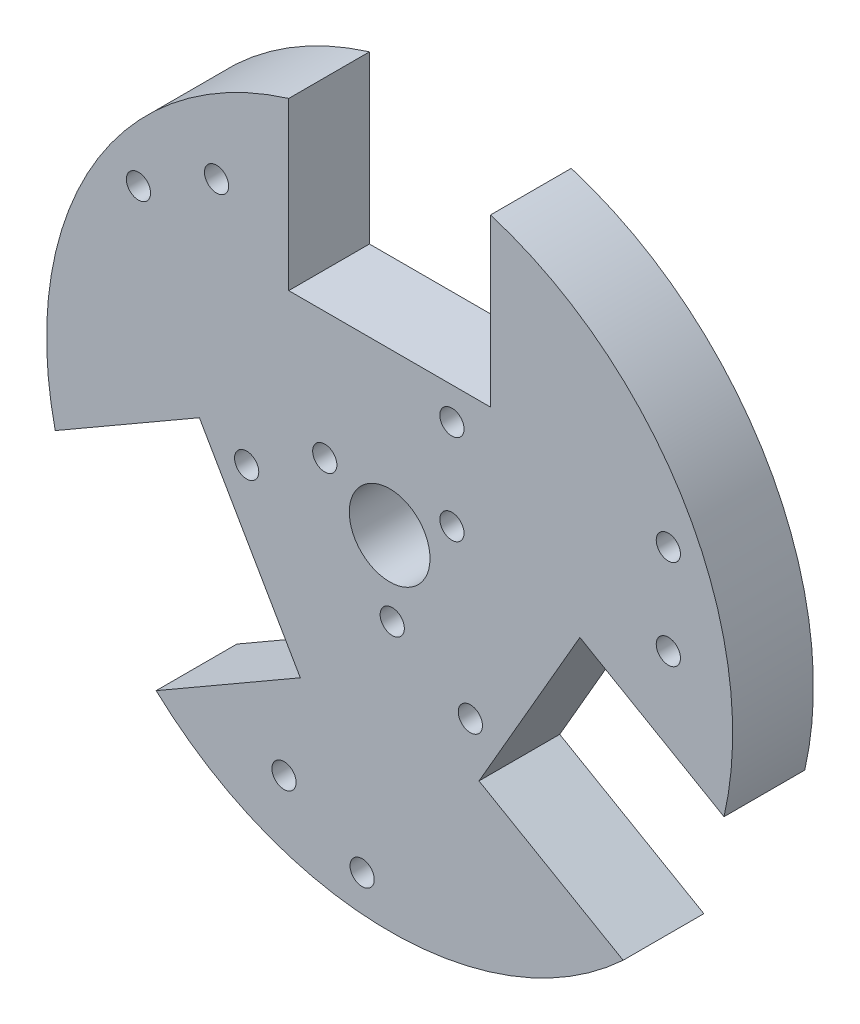
ISO-10303-21;
HEADER;
FILE_DESCRIPTION(('STEP AP214'),'2;1');
FILE_NAME('part.step','',(''),(''),'','','');
FILE_SCHEMA(('AUTOMOTIVE_DESIGN { 1 0 10303 214 1 1 1 1 }'));
ENDSEC;
DATA;
#1=APPLICATION_CONTEXT('core data for automotive mechanical design processes');
#2=APPLICATION_PROTOCOL_DEFINITION('international standard','automotive_design',2000,#1);
#3=PRODUCT_CONTEXT('',#1,'mechanical');
#4=PRODUCT('Part','Part','',(#3));
#5=PRODUCT_RELATED_PRODUCT_CATEGORY('part','',(#4));
#6=PRODUCT_DEFINITION_FORMATION('','',#4);
#7=PRODUCT_DEFINITION_CONTEXT('part definition',#1,'design');
#8=PRODUCT_DEFINITION('design','',#6,#7);
#9=PRODUCT_DEFINITION_SHAPE('','',#8);
#10=(LENGTH_UNIT() NAMED_UNIT(*) SI_UNIT(.MILLI.,.METRE.));
#11=(NAMED_UNIT(*) PLANE_ANGLE_UNIT() SI_UNIT($,.RADIAN.));
#12=(NAMED_UNIT(*) SI_UNIT($,.STERADIAN.) SOLID_ANGLE_UNIT());
#13=UNCERTAINTY_MEASURE_WITH_UNIT(LENGTH_MEASURE(1.E-05),#10,'distance_accuracy_value','');
#14=(GEOMETRIC_REPRESENTATION_CONTEXT(3) GLOBAL_UNCERTAINTY_ASSIGNED_CONTEXT((#13)) GLOBAL_UNIT_ASSIGNED_CONTEXT((#10,
#11,#12)) REPRESENTATION_CONTEXT('',''));
#15=CARTESIAN_POINT('',(0.,0.,0.));
#16=DIRECTION('',(0.,0.,1.));
#17=DIRECTION('',(1.,0.,0.));
#18=AXIS2_PLACEMENT_3D('',#15,#16,#17);
#19=CARTESIAN_POINT('',(0.,0.,10.));
#20=DIRECTION('',(0.,0.,-1.));
#21=DIRECTION('',(-1.,0.,0.));
#22=AXIS2_PLACEMENT_3D('',#19,#20,#21);
#23=CYLINDRICAL_SURFACE('',#22,42.5);
#24=DIRECTION('',(0.,0.,-1.));
#25=VECTOR('',#24,1.);
#26=CARTESIAN_POINT('',(-41.4281181986745,-9.48477846428978,10.));
#27=LINE('',#26,#25);
#28=CARTESIAN_POINT('',(-41.4281181986745,-9.48477846428979,10.));
#29=VERTEX_POINT('',#28);
#30=CARTESIAN_POINT('',(-41.4281181986745,-9.48477846428979,0.));
#31=VERTEX_POINT('',#30);
#32=EDGE_CURVE('E153',#29,#31,#27,.T.);
#33=ORIENTED_EDGE('',*,*,#32,.F.);
#34=CARTESIAN_POINT('',(0.,0.,10.));
#35=DIRECTION('',(0.,0.,1.));
#36=DIRECTION('',(1.,0.,0.));
#37=AXIS2_PLACEMENT_3D('',#34,#35,#36);
#38=CIRCLE('',#37,42.5);
#39=CARTESIAN_POINT('',(-12.5,40.6201920231798,10.));
#40=VERTEX_POINT('',#39);
#41=EDGE_CURVE('E204',#40,#29,#38,.T.);
#42=ORIENTED_EDGE('',*,*,#41,.F.);
#43=DIRECTION('',(0.,0.,-1.));
#44=VECTOR('',#43,1.);
#45=CARTESIAN_POINT('',(-12.5,40.6201920231798,10.));
#46=LINE('',#45,#44);
#47=CARTESIAN_POINT('',(-12.5,40.6201920231798,0.));
#48=VERTEX_POINT('',#47);
#49=EDGE_CURVE('E198',#48,#40,#46,.F.);
#50=ORIENTED_EDGE('',*,*,#49,.F.);
#51=CARTESIAN_POINT('',(0.,0.,0.));
#52=DIRECTION('',(0.,0.,1.));
#53=DIRECTION('',(1.,0.,0.));
#54=AXIS2_PLACEMENT_3D('',#51,#52,#53);
#55=CIRCLE('',#54,42.5);
#56=EDGE_CURVE('E209',#48,#31,#55,.T.);
#57=ORIENTED_EDGE('',*,*,#56,.T.);
#58=EDGE_LOOP('',(#33,#42,#50,#57));
#59=FACE_BOUND('',#58,.T.);
#60=ADVANCED_FACE('F33',(#59),#23,.T.);
#61=DIRECTION('',(0.,0.,-1.));
#62=VECTOR('',#61,1.);
#63=CARTESIAN_POINT('',(-28.9281181986717,-31.1354135588991,10.));
#64=LINE('',#63,#62);
#65=CARTESIAN_POINT('',(-28.9281181986717,-31.1354135588991,0.));
#66=VERTEX_POINT('',#65);
#67=CARTESIAN_POINT('',(-28.9281181986717,-31.1354135588991,10.));
#68=VERTEX_POINT('',#67);
#69=EDGE_CURVE('E128',#66,#68,#64,.F.);
#70=ORIENTED_EDGE('',*,*,#69,.F.);
#71=CARTESIAN_POINT('',(28.9281181986776,-31.1354135588937,0.));
#72=VERTEX_POINT('',#71);
#73=EDGE_CURVE('E212',#66,#72,#55,.T.);
#74=ORIENTED_EDGE('',*,*,#73,.T.);
#75=DIRECTION('',(0.,0.,-1.));
#76=VECTOR('',#75,1.);
#77=CARTESIAN_POINT('',(28.9281181986776,-31.1354135588937,10.));
#78=LINE('',#77,#76);
#79=CARTESIAN_POINT('',(28.9281181986776,-31.1354135588937,10.));
#80=VERTEX_POINT('',#79);
#81=EDGE_CURVE('E178',#80,#72,#78,.T.);
#82=ORIENTED_EDGE('',*,*,#81,.F.);
#83=EDGE_CURVE('E207',#68,#80,#38,.T.);
#84=ORIENTED_EDGE('',*,*,#83,.F.);
#85=EDGE_LOOP('',(#70,#74,#82,#84));
#86=FACE_BOUND('',#85,.T.);
#87=ADVANCED_FACE('F230',(#86),#23,.T.);
#88=CARTESIAN_POINT('',(0.,0.,10.));
#89=DIRECTION('',(0.,0.,1.));
#90=DIRECTION('',(1.,0.,0.));
#91=AXIS2_PLACEMENT_3D('',#88,#89,#90);
#92=PLANE('',#91);
#93=CARTESIAN_POINT('',(-31.1199834685359,21.9013924981958,10.));
#94=DIRECTION('',(0.,0.,1.));
#95=DIRECTION('',(-1.,0.,0.));
#96=AXIS2_PLACEMENT_3D('',#93,#94,#95);
#97=CIRCLE('',#96,1.49999999999364);
#98=CARTESIAN_POINT('',(-32.6199834685295,21.9013924981958,10.));
#99=VERTEX_POINT('',#98);
#100=EDGE_CURVE('E319',#99,#99,#97,.T.);
#101=ORIENTED_EDGE('',*,*,#100,.F.);
#102=EDGE_LOOP('',(#101));
#103=FACE_BOUND('',#102,.T.);
#104=CARTESIAN_POINT('',(-21.4424245852781,27.4887337245432,10.));
#105=DIRECTION('',(0.,0.,1.));
#106=DIRECTION('',(-1.,0.,0.));
#107=AXIS2_PLACEMENT_3D('',#104,#105,#106);
#108=CIRCLE('',#107,1.49999999999374);
#109=CARTESIAN_POINT('',(-22.9424245852718,27.4887337245432,10.));
#110=VERTEX_POINT('',#109);
#111=EDGE_CURVE('E313',#110,#110,#108,.T.);
#112=ORIENTED_EDGE('',*,*,#111,.F.);
#113=EDGE_LOOP('',(#112));
#114=FACE_BOUND('',#113,.T.);
#115=CARTESIAN_POINT('',(-8.03670125236196,4.26933979973166,10.));
#116=DIRECTION('',(0.,0.,1.));
#117=DIRECTION('',(1.,0.,0.));
#118=AXIS2_PLACEMENT_3D('',#115,#116,#117);
#119=CIRCLE('',#118,1.5000000000018);
#120=CARTESIAN_POINT('',(-6.53670125236015,4.26933979973166,10.));
#121=VERTEX_POINT('',#120);
#122=EDGE_CURVE('E307',#121,#121,#119,.T.);
#123=ORIENTED_EDGE('',*,*,#122,.F.);
#124=EDGE_LOOP('',(#123));
#125=FACE_BOUND('',#124,.T.);
#126=CARTESIAN_POINT('',(-17.7142601356198,-1.31800142661571,10.));
#127=DIRECTION('',(0.,0.,1.));
#128=DIRECTION('',(1.,0.,0.));
#129=AXIS2_PLACEMENT_3D('',#126,#127,#128);
#130=CIRCLE('',#129,1.50000000000191);
#131=CARTESIAN_POINT('',(-16.2142601356179,-1.31800142661571,10.));
#132=VERTEX_POINT('',#131);
#133=EDGE_CURVE('E301',#132,#132,#130,.T.);
#134=ORIENTED_EDGE('',*,*,#133,.F.);
#135=EDGE_LOOP('',(#134));
#136=FACE_BOUND('',#135,.T.);
#137=CARTESIAN_POINT('',(-3.4071705474264,-37.9013924982087,10.));
#138=DIRECTION('',(0.,0.,1.));
#139=DIRECTION('',(-1.,0.,0.));
#140=AXIS2_PLACEMENT_3D('',#137,#138,#139);
#141=CIRCLE('',#140,1.50000000000057);
#142=CARTESIAN_POINT('',(-4.90717054742697,-37.9013924982087,10.));
#143=VERTEX_POINT('',#142);
#144=EDGE_CURVE('E295',#143,#143,#141,.T.);
#145=ORIENTED_EDGE('',*,*,#144,.F.);
#146=EDGE_LOOP('',(#145));
#147=FACE_BOUND('',#146,.T.);
#148=CARTESIAN_POINT('',(-13.0847294306842,-32.3140512718613,10.));
#149=DIRECTION('',(0.,0.,1.));
#150=DIRECTION('',(-1.,0.,0.));
#151=AXIS2_PLACEMENT_3D('',#148,#149,#150);
#152=CIRCLE('',#151,1.50000000000061);
#153=CARTESIAN_POINT('',(-14.5847294306848,-32.3140512718613,10.));
#154=VERTEX_POINT('',#153);
#155=EDGE_CURVE('E289',#154,#154,#152,.T.);
#156=ORIENTED_EDGE('',*,*,#155,.F.);
#157=EDGE_LOOP('',(#156));
#158=FACE_BOUND('',#157,.T.);
#159=CARTESIAN_POINT('',(0.320993902225922,-9.09465734703954,10.));
#160=DIRECTION('',(0.,0.,1.));
#161=DIRECTION('',(1.,0.,0.));
#162=AXIS2_PLACEMENT_3D('',#159,#160,#161);
#163=CIRCLE('',#162,1.49999999999993);
#164=CARTESIAN_POINT('',(1.82099390222585,-9.09465734703954,10.));
#165=VERTEX_POINT('',#164);
#166=EDGE_CURVE('E283',#165,#165,#163,.T.);
#167=ORIENTED_EDGE('',*,*,#166,.F.);
#168=EDGE_LOOP('',(#167));
#169=FACE_BOUND('',#168,.T.);
#170=CARTESIAN_POINT('',(9.99855278548375,-14.6819985733869,10.));
#171=DIRECTION('',(0.,0.,1.));
#172=DIRECTION('',(1.,0.,0.));
#173=AXIS2_PLACEMENT_3D('',#170,#171,#172);
#174=CIRCLE('',#173,1.49999999999998);
#175=CARTESIAN_POINT('',(11.4985527854837,-14.6819985733869,10.));
#176=VERTEX_POINT('',#175);
#177=EDGE_CURVE('E277',#176,#176,#174,.T.);
#178=ORIENTED_EDGE('',*,*,#177,.F.);
#179=EDGE_LOOP('',(#178));
#180=FACE_BOUND('',#179,.T.);
#181=CARTESIAN_POINT('',(34.527154015964,16.,10.));
#182=DIRECTION('',(0.,0.,1.));
#183=DIRECTION('',(-1.,0.,0.));
#184=AXIS2_PLACEMENT_3D('',#181,#182,#183);
#185=CIRCLE('',#184,1.5);
#186=CARTESIAN_POINT('',(33.027154015964,16.,10.));
#187=VERTEX_POINT('',#186);
#188=EDGE_CURVE('E271',#187,#187,#185,.T.);
#189=ORIENTED_EDGE('',*,*,#188,.F.);
#190=EDGE_LOOP('',(#189));
#191=FACE_BOUND('',#190,.T.);
#192=CARTESIAN_POINT('',(34.527154015964,4.82531754730527,10.));
#193=DIRECTION('',(0.,0.,1.));
#194=DIRECTION('',(-1.,0.,0.));
#195=AXIS2_PLACEMENT_3D('',#192,#193,#194);
#196=CIRCLE('',#195,1.5);
#197=CARTESIAN_POINT('',(33.027154015964,4.82531754730527,10.));
#198=VERTEX_POINT('',#197);
#199=EDGE_CURVE('E265',#198,#198,#196,.T.);
#200=ORIENTED_EDGE('',*,*,#199,.F.);
#201=EDGE_LOOP('',(#200));
#202=FACE_BOUND('',#201,.T.);
#203=CARTESIAN_POINT('',(7.7157073501386,4.82531754730527,10.));
#204=DIRECTION('',(0.,0.,1.));
#205=DIRECTION('',(1.,0.,0.));
#206=AXIS2_PLACEMENT_3D('',#203,#204,#205);
#207=CIRCLE('',#206,1.5);
#208=CARTESIAN_POINT('',(9.2157073501386,4.82531754730527,10.));
#209=VERTEX_POINT('',#208);
#210=EDGE_CURVE('E259',#209,#209,#207,.T.);
#211=ORIENTED_EDGE('',*,*,#210,.F.);
#212=EDGE_LOOP('',(#211));
#213=FACE_BOUND('',#212,.T.);
#214=CARTESIAN_POINT('',(7.7157073501386,16.,10.));
#215=DIRECTION('',(0.,0.,1.));
#216=DIRECTION('',(1.,0.,0.));
#217=AXIS2_PLACEMENT_3D('',#214,#215,#216);
#218=CIRCLE('',#217,1.5);
#219=CARTESIAN_POINT('',(9.2157073501386,16.,10.));
#220=VERTEX_POINT('',#219);
#221=EDGE_CURVE('E150',#220,#220,#218,.T.);
#222=ORIENTED_EDGE('',*,*,#221,.F.);
#223=EDGE_LOOP('',(#222));
#224=FACE_BOUND('',#223,.T.);
#225=CARTESIAN_POINT('',(0.,0.,10.));
#226=DIRECTION('',(0.,0.,1.));
#227=DIRECTION('',(1.,0.,0.));
#228=AXIS2_PLACEMENT_3D('',#225,#226,#227);
#229=CIRCLE('',#228,5.);
#230=CARTESIAN_POINT('',(5.,0.,10.));
#231=VERTEX_POINT('',#230);
#232=EDGE_CURVE('E156',#231,#231,#229,.T.);
#233=ORIENTED_EDGE('',*,*,#232,.F.);
#234=EDGE_LOOP('',(#233));
#235=FACE_BOUND('',#234,.T.);
#236=ORIENTED_EDGE('',*,*,#41,.T.);
#237=DIRECTION('',(-0.866025403784438,-0.500000000000001,0.));
#238=VECTOR('',#237,1.);
#239=CARTESIAN_POINT('',(-23.5705080756863,0.825317547300831,10.));
#240=LINE('',#239,#238);
#241=CARTESIAN_POINT('',(-23.5705080756863,0.825317547300831,10.));
#242=VERTEX_POINT('',#241);
#243=EDGE_CURVE('E133',#242,#29,#240,.T.);
#244=ORIENTED_EDGE('',*,*,#243,.F.);
#245=DIRECTION('',(-0.5,0.866025403784438,0.));
#246=VECTOR('',#245,1.);
#247=CARTESIAN_POINT('',(-23.5705080756863,0.825317547300831,10.));
#248=LINE('',#247,#246);
#249=CARTESIAN_POINT('',(-11.0705080756863,-20.8253175473101,10.));
#250=VERTEX_POINT('',#249);
#251=EDGE_CURVE('E132',#250,#242,#248,.T.);
#252=ORIENTED_EDGE('',*,*,#251,.F.);
#253=DIRECTION('',(0.866025403784438,0.5,0.));
#254=VECTOR('',#253,1.);
#255=CARTESIAN_POINT('',(-11.0705080756863,-20.8253175473101,10.));
#256=LINE('',#255,#254);
#257=EDGE_CURVE('E122',#68,#250,#256,.T.);
#258=ORIENTED_EDGE('',*,*,#257,.F.);
#259=ORIENTED_EDGE('',*,*,#83,.T.);
#260=DIRECTION('',(0.866025403784439,-0.5,0.));
#261=VECTOR('',#260,1.);
#262=CARTESIAN_POINT('',(11.070508075694,-20.8253175473057,10.));
#263=LINE('',#262,#261);
#264=CARTESIAN_POINT('',(11.070508075694,-20.8253175473057,10.));
#265=VERTEX_POINT('',#264);
#266=EDGE_CURVE('E161',#265,#80,#263,.T.);
#267=ORIENTED_EDGE('',*,*,#266,.F.);
#268=DIRECTION('',(-0.5,-0.866025403784439,0.));
#269=VECTOR('',#268,1.);
#270=CARTESIAN_POINT('',(11.070508075694,-20.8253175473057,10.));
#271=LINE('',#270,#269);
#272=CARTESIAN_POINT('',(23.570508075694,0.825317547305273,10.));
#273=VERTEX_POINT('',#272);
#274=EDGE_CURVE('E167',#273,#265,#271,.T.);
#275=ORIENTED_EDGE('',*,*,#274,.F.);
#276=DIRECTION('',(-0.866025403784439,0.5,0.));
#277=VECTOR('',#276,1.);
#278=CARTESIAN_POINT('',(23.570508075694,0.825317547305273,10.));
#279=LINE('',#278,#277);
#280=CARTESIAN_POINT('',(41.4281181986763,-9.48477846428194,10.));
#281=VERTEX_POINT('',#280);
#282=EDGE_CURVE('E164',#281,#273,#279,.T.);
#283=ORIENTED_EDGE('',*,*,#282,.F.);
#284=CARTESIAN_POINT('',(12.5,40.6201920231798,10.));
#285=VERTEX_POINT('',#284);
#286=EDGE_CURVE('E208',#281,#285,#38,.T.);
#287=ORIENTED_EDGE('',*,*,#286,.T.);
#288=DIRECTION('',(0.,1.,0.));
#289=VECTOR('',#288,1.);
#290=CARTESIAN_POINT('',(12.5,20.,10.));
#291=LINE('',#290,#289);
#292=CARTESIAN_POINT('',(12.5,20.,10.));
#293=VERTEX_POINT('',#292);
#294=EDGE_CURVE('E181',#293,#285,#291,.T.);
#295=ORIENTED_EDGE('',*,*,#294,.F.);
#296=DIRECTION('',(1.,0.,0.));
#297=VECTOR('',#296,1.);
#298=CARTESIAN_POINT('',(12.5,20.,10.));
#299=LINE('',#298,#297);
#300=CARTESIAN_POINT('',(-12.5,20.,10.));
#301=VERTEX_POINT('',#300);
#302=EDGE_CURVE('E187',#301,#293,#299,.T.);
#303=ORIENTED_EDGE('',*,*,#302,.F.);
#304=DIRECTION('',(0.,-1.,0.));
#305=VECTOR('',#304,1.);
#306=CARTESIAN_POINT('',(-12.5,20.,10.));
#307=LINE('',#306,#305);
#308=EDGE_CURVE('E184',#40,#301,#307,.T.);
#309=ORIENTED_EDGE('',*,*,#308,.F.);
#310=EDGE_LOOP('',(#236,#244,#252,#258,#259,#267,#275,#283,#287,#295,#303,#309));
#311=FACE_BOUND('',#310,.T.);
#312=ADVANCED_FACE('F144',(#103,#114,#125,#136,#147,#158,#169,#180,#191,#202,#213,#224,#235,
#311),#92,.T.);
#313=CARTESIAN_POINT('',(0.,0.,0.));
#314=DIRECTION('',(0.,0.,1.));
#315=DIRECTION('',(1.,0.,0.));
#316=AXIS2_PLACEMENT_3D('',#313,#314,#315);
#317=PLANE('',#316);
#318=CARTESIAN_POINT('',(-31.1199834685359,21.9013924981958,0.));
#319=DIRECTION('',(0.,0.,1.));
#320=DIRECTION('',(-1.,0.,0.));
#321=AXIS2_PLACEMENT_3D('',#318,#319,#320);
#322=CIRCLE('',#321,1.49999999999364);
#323=CARTESIAN_POINT('',(-32.6199834685295,21.9013924981958,0.));
#324=VERTEX_POINT('',#323);
#325=EDGE_CURVE('E322',#324,#324,#322,.T.);
#326=ORIENTED_EDGE('',*,*,#325,.T.);
#327=EDGE_LOOP('',(#326));
#328=FACE_BOUND('',#327,.T.);
#329=CARTESIAN_POINT('',(-21.4424245852781,27.4887337245432,0.));
#330=DIRECTION('',(0.,0.,1.));
#331=DIRECTION('',(-1.,0.,0.));
#332=AXIS2_PLACEMENT_3D('',#329,#330,#331);
#333=CIRCLE('',#332,1.49999999999374);
#334=CARTESIAN_POINT('',(-22.9424245852718,27.4887337245432,0.));
#335=VERTEX_POINT('',#334);
#336=EDGE_CURVE('E316',#335,#335,#333,.T.);
#337=ORIENTED_EDGE('',*,*,#336,.T.);
#338=EDGE_LOOP('',(#337));
#339=FACE_BOUND('',#338,.T.);
#340=CARTESIAN_POINT('',(-8.03670125236196,4.26933979973166,0.));
#341=DIRECTION('',(0.,0.,1.));
#342=DIRECTION('',(1.,0.,0.));
#343=AXIS2_PLACEMENT_3D('',#340,#341,#342);
#344=CIRCLE('',#343,1.5000000000018);
#345=CARTESIAN_POINT('',(-6.53670125236015,4.26933979973166,0.));
#346=VERTEX_POINT('',#345);
#347=EDGE_CURVE('E310',#346,#346,#344,.T.);
#348=ORIENTED_EDGE('',*,*,#347,.T.);
#349=EDGE_LOOP('',(#348));
#350=FACE_BOUND('',#349,.T.);
#351=CARTESIAN_POINT('',(-17.7142601356198,-1.31800142661571,0.));
#352=DIRECTION('',(0.,0.,1.));
#353=DIRECTION('',(1.,0.,0.));
#354=AXIS2_PLACEMENT_3D('',#351,#352,#353);
#355=CIRCLE('',#354,1.50000000000191);
#356=CARTESIAN_POINT('',(-16.2142601356179,-1.31800142661571,0.));
#357=VERTEX_POINT('',#356);
#358=EDGE_CURVE('E304',#357,#357,#355,.T.);
#359=ORIENTED_EDGE('',*,*,#358,.T.);
#360=EDGE_LOOP('',(#359));
#361=FACE_BOUND('',#360,.T.);
#362=CARTESIAN_POINT('',(-3.4071705474264,-37.9013924982087,0.));
#363=DIRECTION('',(0.,0.,1.));
#364=DIRECTION('',(-1.,0.,0.));
#365=AXIS2_PLACEMENT_3D('',#362,#363,#364);
#366=CIRCLE('',#365,1.50000000000057);
#367=CARTESIAN_POINT('',(-4.90717054742697,-37.9013924982087,0.));
#368=VERTEX_POINT('',#367);
#369=EDGE_CURVE('E298',#368,#368,#366,.T.);
#370=ORIENTED_EDGE('',*,*,#369,.T.);
#371=EDGE_LOOP('',(#370));
#372=FACE_BOUND('',#371,.T.);
#373=CARTESIAN_POINT('',(-13.0847294306842,-32.3140512718613,0.));
#374=DIRECTION('',(0.,0.,1.));
#375=DIRECTION('',(-1.,0.,0.));
#376=AXIS2_PLACEMENT_3D('',#373,#374,#375);
#377=CIRCLE('',#376,1.50000000000061);
#378=CARTESIAN_POINT('',(-14.5847294306848,-32.3140512718613,0.));
#379=VERTEX_POINT('',#378);
#380=EDGE_CURVE('E292',#379,#379,#377,.T.);
#381=ORIENTED_EDGE('',*,*,#380,.T.);
#382=EDGE_LOOP('',(#381));
#383=FACE_BOUND('',#382,.T.);
#384=CARTESIAN_POINT('',(0.320993902225922,-9.09465734703954,0.));
#385=DIRECTION('',(0.,0.,1.));
#386=DIRECTION('',(1.,0.,0.));
#387=AXIS2_PLACEMENT_3D('',#384,#385,#386);
#388=CIRCLE('',#387,1.49999999999993);
#389=CARTESIAN_POINT('',(1.82099390222585,-9.09465734703954,0.));
#390=VERTEX_POINT('',#389);
#391=EDGE_CURVE('E286',#390,#390,#388,.T.);
#392=ORIENTED_EDGE('',*,*,#391,.T.);
#393=EDGE_LOOP('',(#392));
#394=FACE_BOUND('',#393,.T.);
#395=CARTESIAN_POINT('',(9.99855278548375,-14.6819985733869,0.));
#396=DIRECTION('',(0.,0.,1.));
#397=DIRECTION('',(1.,0.,0.));
#398=AXIS2_PLACEMENT_3D('',#395,#396,#397);
#399=CIRCLE('',#398,1.49999999999998);
#400=CARTESIAN_POINT('',(11.4985527854837,-14.6819985733869,0.));
#401=VERTEX_POINT('',#400);
#402=EDGE_CURVE('E280',#401,#401,#399,.T.);
#403=ORIENTED_EDGE('',*,*,#402,.T.);
#404=EDGE_LOOP('',(#403));
#405=FACE_BOUND('',#404,.T.);
#406=CARTESIAN_POINT('',(34.527154015964,16.,0.));
#407=DIRECTION('',(0.,0.,1.));
#408=DIRECTION('',(-1.,0.,0.));
#409=AXIS2_PLACEMENT_3D('',#406,#407,#408);
#410=CIRCLE('',#409,1.5);
#411=CARTESIAN_POINT('',(33.027154015964,16.,0.));
#412=VERTEX_POINT('',#411);
#413=EDGE_CURVE('E274',#412,#412,#410,.T.);
#414=ORIENTED_EDGE('',*,*,#413,.T.);
#415=EDGE_LOOP('',(#414));
#416=FACE_BOUND('',#415,.T.);
#417=CARTESIAN_POINT('',(34.527154015964,4.82531754730527,0.));
#418=DIRECTION('',(0.,0.,1.));
#419=DIRECTION('',(-1.,0.,0.));
#420=AXIS2_PLACEMENT_3D('',#417,#418,#419);
#421=CIRCLE('',#420,1.5);
#422=CARTESIAN_POINT('',(33.027154015964,4.82531754730527,0.));
#423=VERTEX_POINT('',#422);
#424=EDGE_CURVE('E268',#423,#423,#421,.T.);
#425=ORIENTED_EDGE('',*,*,#424,.T.);
#426=EDGE_LOOP('',(#425));
#427=FACE_BOUND('',#426,.T.);
#428=CARTESIAN_POINT('',(7.7157073501386,4.82531754730527,0.));
#429=DIRECTION('',(0.,0.,1.));
#430=DIRECTION('',(1.,0.,0.));
#431=AXIS2_PLACEMENT_3D('',#428,#429,#430);
#432=CIRCLE('',#431,1.5);
#433=CARTESIAN_POINT('',(9.2157073501386,4.82531754730527,0.));
#434=VERTEX_POINT('',#433);
#435=EDGE_CURVE('E262',#434,#434,#432,.T.);
#436=ORIENTED_EDGE('',*,*,#435,.T.);
#437=EDGE_LOOP('',(#436));
#438=FACE_BOUND('',#437,.T.);
#439=CARTESIAN_POINT('',(7.7157073501386,16.,0.));
#440=DIRECTION('',(0.,0.,1.));
#441=DIRECTION('',(1.,0.,0.));
#442=AXIS2_PLACEMENT_3D('',#439,#440,#441);
#443=CIRCLE('',#442,1.5);
#444=CARTESIAN_POINT('',(9.2157073501386,16.,0.));
#445=VERTEX_POINT('',#444);
#446=EDGE_CURVE('E256',#445,#445,#443,.T.);
#447=ORIENTED_EDGE('',*,*,#446,.T.);
#448=EDGE_LOOP('',(#447));
#449=FACE_BOUND('',#448,.T.);
#450=CARTESIAN_POINT('',(0.,0.,0.));
#451=DIRECTION('',(0.,0.,1.));
#452=DIRECTION('',(1.,0.,0.));
#453=AXIS2_PLACEMENT_3D('',#450,#451,#452);
#454=CIRCLE('',#453,5.);
#455=CARTESIAN_POINT('',(5.,0.,0.));
#456=VERTEX_POINT('',#455);
#457=EDGE_CURVE('E155',#456,#456,#454,.T.);
#458=ORIENTED_EDGE('',*,*,#457,.T.);
#459=EDGE_LOOP('',(#458));
#460=FACE_BOUND('',#459,.T.);
#461=DIRECTION('',(-0.866025403784438,-0.500000000000001,0.));
#462=VECTOR('',#461,1.);
#463=CARTESIAN_POINT('',(-23.5705080756863,0.825317547300831,0.));
#464=LINE('',#463,#462);
#465=CARTESIAN_POINT('',(-23.5705080756863,0.82531754730083,0.));
#466=VERTEX_POINT('',#465);
#467=EDGE_CURVE('E47',#466,#31,#464,.T.);
#468=ORIENTED_EDGE('',*,*,#467,.T.);
#469=ORIENTED_EDGE('',*,*,#56,.F.);
#470=DIRECTION('',(0.,1.,0.));
#471=VECTOR('',#470,1.);
#472=CARTESIAN_POINT('',(-12.5,0.,0.));
#473=LINE('',#472,#471);
#474=CARTESIAN_POINT('',(-12.5,20.,0.));
#475=VERTEX_POINT('',#474);
#476=EDGE_CURVE('E206',#475,#48,#473,.T.);
#477=ORIENTED_EDGE('',*,*,#476,.F.);
#478=DIRECTION('',(1.,0.,0.));
#479=VECTOR('',#478,1.);
#480=CARTESIAN_POINT('',(12.5,20.,0.));
#481=LINE('',#480,#479);
#482=CARTESIAN_POINT('',(12.5,20.,0.));
#483=VERTEX_POINT('',#482);
#484=EDGE_CURVE('E185',#475,#483,#481,.T.);
#485=ORIENTED_EDGE('',*,*,#484,.T.);
#486=DIRECTION('',(0.,1.,0.));
#487=VECTOR('',#486,1.);
#488=CARTESIAN_POINT('',(12.5,20.,0.));
#489=LINE('',#488,#487);
#490=CARTESIAN_POINT('',(12.5,40.6201920231798,0.));
#491=VERTEX_POINT('',#490);
#492=EDGE_CURVE('E180',#483,#491,#489,.T.);
#493=ORIENTED_EDGE('',*,*,#492,.T.);
#494=CARTESIAN_POINT('',(41.4281181986763,-9.48477846428194,0.));
#495=VERTEX_POINT('',#494);
#496=EDGE_CURVE('E203',#495,#491,#55,.T.);
#497=ORIENTED_EDGE('',*,*,#496,.F.);
#498=DIRECTION('',(0.866025403784439,-0.5,0.));
#499=VECTOR('',#498,1.);
#500=CARTESIAN_POINT('',(6.25000000000121,10.8253175473076,0.));
#501=LINE('',#500,#499);
#502=CARTESIAN_POINT('',(23.570508075694,0.825317547305273,0.));
#503=VERTEX_POINT('',#502);
#504=EDGE_CURVE('E40',#503,#495,#501,.T.);
#505=ORIENTED_EDGE('',*,*,#504,.F.);
#506=DIRECTION('',(-0.5,-0.866025403784439,0.));
#507=VECTOR('',#506,1.);
#508=CARTESIAN_POINT('',(11.070508075694,-20.8253175473057,0.));
#509=LINE('',#508,#507);
#510=CARTESIAN_POINT('',(11.070508075694,-20.8253175473057,0.));
#511=VERTEX_POINT('',#510);
#512=EDGE_CURVE('E165',#503,#511,#509,.T.);
#513=ORIENTED_EDGE('',*,*,#512,.T.);
#514=DIRECTION('',(0.866025403784439,-0.5,0.));
#515=VECTOR('',#514,1.);
#516=CARTESIAN_POINT('',(11.070508075694,-20.8253175473057,0.));
#517=LINE('',#516,#515);
#518=EDGE_CURVE('E55',#511,#72,#517,.T.);
#519=ORIENTED_EDGE('',*,*,#518,.T.);
#520=ORIENTED_EDGE('',*,*,#73,.F.);
#521=DIRECTION('',(-0.866025403784438,-0.500000000000001,0.));
#522=VECTOR('',#521,1.);
#523=CARTESIAN_POINT('',(6.25000000000262,-10.82531754731,0.));
#524=LINE('',#523,#522);
#525=CARTESIAN_POINT('',(-11.0705080756863,-20.8253175473101,0.));
#526=VERTEX_POINT('',#525);
#527=EDGE_CURVE('E11',#526,#66,#524,.T.);
#528=ORIENTED_EDGE('',*,*,#527,.F.);
#529=DIRECTION('',(-0.5,0.866025403784438,0.));
#530=VECTOR('',#529,1.);
#531=CARTESIAN_POINT('',(-23.5705080756863,0.825317547300831,0.));
#532=LINE('',#531,#530);
#533=EDGE_CURVE('E138',#526,#466,#532,.T.);
#534=ORIENTED_EDGE('',*,*,#533,.T.);
#535=EDGE_LOOP('',(#468,#469,#477,#485,#493,#497,#505,#513,#519,#520,#528,#534));
#536=FACE_BOUND('',#535,.T.);
#537=ADVANCED_FACE('F226',(#328,#339,#350,#361,#372,#383,#394,#405,#416,#427,#438,#449,#460,
#536),#317,.F.);
#538=DIRECTION('',(0.,0.,-1.));
#539=VECTOR('',#538,1.);
#540=CARTESIAN_POINT('',(41.4281181986763,-9.48477846428194,10.));
#541=LINE('',#540,#539);
#542=EDGE_CURVE('E176',#495,#281,#541,.F.);
#543=ORIENTED_EDGE('',*,*,#542,.F.);
#544=ORIENTED_EDGE('',*,*,#496,.T.);
#545=DIRECTION('',(0.,0.,-1.));
#546=VECTOR('',#545,1.);
#547=CARTESIAN_POINT('',(12.5,40.6201920231798,10.));
#548=LINE('',#547,#546);
#549=EDGE_CURVE('E200',#285,#491,#548,.T.);
#550=ORIENTED_EDGE('',*,*,#549,.F.);
#551=ORIENTED_EDGE('',*,*,#286,.F.);
#552=EDGE_LOOP('',(#543,#544,#550,#551));
#553=FACE_BOUND('',#552,.T.);
#554=ADVANCED_FACE('F224',(#553),#23,.T.);
#555=CARTESIAN_POINT('',(12.5,20.,10.));
#556=DIRECTION('',(-1.,0.,0.));
#557=DIRECTION('',(0.,0.,1.));
#558=AXIS2_PLACEMENT_3D('',#555,#556,#557);
#559=PLANE('',#558);
#560=ORIENTED_EDGE('',*,*,#549,.T.);
#561=ORIENTED_EDGE('',*,*,#492,.F.);
#562=DIRECTION('',(0.,0.,-1.));
#563=VECTOR('',#562,1.);
#564=CARTESIAN_POINT('',(12.5,20.,10.));
#565=LINE('',#564,#563);
#566=EDGE_CURVE('E189',#293,#483,#565,.T.);
#567=ORIENTED_EDGE('',*,*,#566,.F.);
#568=ORIENTED_EDGE('',*,*,#294,.T.);
#569=EDGE_LOOP('',(#560,#561,#567,#568));
#570=FACE_BOUND('',#569,.T.);
#571=ADVANCED_FACE('F240',(#570),#559,.T.);
#572=CARTESIAN_POINT('',(-12.5,20.,10.));
#573=DIRECTION('',(1.,0.,0.));
#574=DIRECTION('',(0.,0.,-1.));
#575=AXIS2_PLACEMENT_3D('',#572,#573,#574);
#576=PLANE('',#575);
#577=ORIENTED_EDGE('',*,*,#49,.T.);
#578=ORIENTED_EDGE('',*,*,#308,.T.);
#579=DIRECTION('',(0.,0.,-1.));
#580=VECTOR('',#579,1.);
#581=CARTESIAN_POINT('',(-12.5,20.,10.));
#582=LINE('',#581,#580);
#583=EDGE_CURVE('E196',#301,#475,#582,.T.);
#584=ORIENTED_EDGE('',*,*,#583,.T.);
#585=ORIENTED_EDGE('',*,*,#476,.T.);
#586=EDGE_LOOP('',(#577,#578,#584,#585));
#587=FACE_BOUND('',#586,.T.);
#588=ADVANCED_FACE('F249',(#587),#576,.T.);
#589=CARTESIAN_POINT('',(12.5,20.,10.));
#590=DIRECTION('',(0.,1.,0.));
#591=DIRECTION('',(0.,0.,1.));
#592=AXIS2_PLACEMENT_3D('',#589,#590,#591);
#593=PLANE('',#592);
#594=ORIENTED_EDGE('',*,*,#484,.F.);
#595=ORIENTED_EDGE('',*,*,#583,.F.);
#596=ORIENTED_EDGE('',*,*,#302,.T.);
#597=ORIENTED_EDGE('',*,*,#566,.T.);
#598=EDGE_LOOP('',(#594,#595,#596,#597));
#599=FACE_BOUND('',#598,.T.);
#600=ADVANCED_FACE('F243',(#599),#593,.T.);
#601=CARTESIAN_POINT('',(11.070508075694,-20.8253175473057,10.));
#602=DIRECTION('',(0.5,0.866025403784439,0.));
#603=DIRECTION('',(-0.866025403784439,0.5,0.));
#604=AXIS2_PLACEMENT_3D('',#601,#602,#603);
#605=PLANE('',#604);
#606=ORIENTED_EDGE('',*,*,#81,.T.);
#607=ORIENTED_EDGE('',*,*,#518,.F.);
#608=DIRECTION('',(0.,0.,-1.));
#609=VECTOR('',#608,1.);
#610=CARTESIAN_POINT('',(11.070508075694,-20.8253175473057,10.));
#611=LINE('',#610,#609);
#612=EDGE_CURVE('E169',#265,#511,#611,.T.);
#613=ORIENTED_EDGE('',*,*,#612,.F.);
#614=ORIENTED_EDGE('',*,*,#266,.T.);
#615=EDGE_LOOP('',(#606,#607,#613,#614));
#616=FACE_BOUND('',#615,.T.);
#617=ADVANCED_FACE('F231',(#616),#605,.T.);
#618=CARTESIAN_POINT('',(23.570508075694,0.825317547305273,10.));
#619=DIRECTION('',(-0.5,-0.866025403784439,0.));
#620=DIRECTION('',(0.866025403784439,-0.5,0.));
#621=AXIS2_PLACEMENT_3D('',#618,#619,#620);
#622=PLANE('',#621);
#623=ORIENTED_EDGE('',*,*,#542,.T.);
#624=ORIENTED_EDGE('',*,*,#282,.T.);
#625=DIRECTION('',(0.,0.,-1.));
#626=VECTOR('',#625,1.);
#627=CARTESIAN_POINT('',(23.570508075694,0.825317547305273,10.));
#628=LINE('',#627,#626);
#629=EDGE_CURVE('E174',#273,#503,#628,.T.);
#630=ORIENTED_EDGE('',*,*,#629,.T.);
#631=ORIENTED_EDGE('',*,*,#504,.T.);
#632=EDGE_LOOP('',(#623,#624,#630,#631));
#633=FACE_BOUND('',#632,.T.);
#634=ADVANCED_FACE('F216',(#633),#622,.T.);
#635=CARTESIAN_POINT('',(11.070508075694,-20.8253175473057,10.));
#636=DIRECTION('',(0.866025403784439,-0.5,0.));
#637=DIRECTION('',(0.5,0.866025403784439,0.));
#638=AXIS2_PLACEMENT_3D('',#635,#636,#637);
#639=PLANE('',#638);
#640=ORIENTED_EDGE('',*,*,#512,.F.);
#641=ORIENTED_EDGE('',*,*,#629,.F.);
#642=ORIENTED_EDGE('',*,*,#274,.T.);
#643=ORIENTED_EDGE('',*,*,#612,.T.);
#644=EDGE_LOOP('',(#640,#641,#642,#643));
#645=FACE_BOUND('',#644,.T.);
#646=ADVANCED_FACE('F234',(#645),#639,.T.);
#647=CARTESIAN_POINT('',(0.,0.,10.));
#648=DIRECTION('',(0.,0.,-1.));
#649=DIRECTION('',(-1.,0.,0.));
#650=AXIS2_PLACEMENT_3D('',#647,#648,#649);
#651=CYLINDRICAL_SURFACE('',#650,5.);
#652=ORIENTED_EDGE('',*,*,#232,.T.);
#653=EDGE_LOOP('',(#652));
#654=FACE_BOUND('',#653,.T.);
#655=ORIENTED_EDGE('',*,*,#457,.F.);
#656=EDGE_LOOP('',(#655));
#657=FACE_BOUND('',#656,.T.);
#658=ADVANCED_FACE('F358',(#654,#657),#651,.F.);
#659=CARTESIAN_POINT('',(-23.5705080756863,0.825317547300831,10.));
#660=DIRECTION('',(0.500000000000001,-0.866025403784438,0.));
#661=DIRECTION('',(0.866025403784438,0.500000000000001,0.));
#662=AXIS2_PLACEMENT_3D('',#659,#660,#661);
#663=PLANE('',#662);
#664=ORIENTED_EDGE('',*,*,#32,.T.);
#665=ORIENTED_EDGE('',*,*,#467,.F.);
#666=DIRECTION('',(0.,0.,-1.));
#667=VECTOR('',#666,1.);
#668=CARTESIAN_POINT('',(-23.5705080756863,0.825317547300831,10.));
#669=LINE('',#668,#667);
#670=EDGE_CURVE('E140',#242,#466,#669,.T.);
#671=ORIENTED_EDGE('',*,*,#670,.F.);
#672=ORIENTED_EDGE('',*,*,#243,.T.);
#673=EDGE_LOOP('',(#664,#665,#671,#672));
#674=FACE_BOUND('',#673,.T.);
#675=ADVANCED_FACE('F254',(#674),#663,.T.);
#676=CARTESIAN_POINT('',(-11.0705080756863,-20.8253175473101,10.));
#677=DIRECTION('',(-0.5,0.866025403784438,0.));
#678=DIRECTION('',(-0.866025403784438,-0.500000000000001,0.));
#679=AXIS2_PLACEMENT_3D('',#676,#677,#678);
#680=PLANE('',#679);
#681=ORIENTED_EDGE('',*,*,#69,.T.);
#682=ORIENTED_EDGE('',*,*,#257,.T.);
#683=DIRECTION('',(0.,0.,-1.));
#684=VECTOR('',#683,1.);
#685=CARTESIAN_POINT('',(-11.0705080756863,-20.8253175473101,10.));
#686=LINE('',#685,#684);
#687=EDGE_CURVE('E125',#250,#526,#686,.T.);
#688=ORIENTED_EDGE('',*,*,#687,.T.);
#689=ORIENTED_EDGE('',*,*,#527,.T.);
#690=EDGE_LOOP('',(#681,#682,#688,#689));
#691=FACE_BOUND('',#690,.T.);
#692=ADVANCED_FACE('F124',(#691),#680,.T.);
#693=CARTESIAN_POINT('',(-23.5705080756863,0.825317547300831,10.));
#694=DIRECTION('',(-0.866025403784438,-0.5,0.));
#695=DIRECTION('',(0.5,-0.866025403784438,0.));
#696=AXIS2_PLACEMENT_3D('',#693,#694,#695);
#697=PLANE('',#696);
#698=ORIENTED_EDGE('',*,*,#533,.F.);
#699=ORIENTED_EDGE('',*,*,#687,.F.);
#700=ORIENTED_EDGE('',*,*,#251,.T.);
#701=ORIENTED_EDGE('',*,*,#670,.T.);
#702=EDGE_LOOP('',(#698,#699,#700,#701));
#703=FACE_BOUND('',#702,.T.);
#704=ADVANCED_FACE('F136',(#703),#697,.T.);
#705=CARTESIAN_POINT('',(7.7157073501386,16.,10.));
#706=DIRECTION('',(0.,0.,-1.));
#707=DIRECTION('',(-1.,0.,0.));
#708=AXIS2_PLACEMENT_3D('',#705,#706,#707);
#709=CYLINDRICAL_SURFACE('',#708,1.5);
#710=ORIENTED_EDGE('',*,*,#221,.T.);
#711=EDGE_LOOP('',(#710));
#712=FACE_BOUND('',#711,.T.);
#713=ORIENTED_EDGE('',*,*,#446,.F.);
#714=EDGE_LOOP('',(#713));
#715=FACE_BOUND('',#714,.T.);
#716=ADVANCED_FACE('F396',(#712,#715),#709,.F.);
#717=CARTESIAN_POINT('',(7.7157073501386,4.82531754730527,10.));
#718=DIRECTION('',(0.,0.,-1.));
#719=DIRECTION('',(-1.,0.,0.));
#720=AXIS2_PLACEMENT_3D('',#717,#718,#719);
#721=CYLINDRICAL_SURFACE('',#720,1.5);
#722=ORIENTED_EDGE('',*,*,#210,.T.);
#723=EDGE_LOOP('',(#722));
#724=FACE_BOUND('',#723,.T.);
#725=ORIENTED_EDGE('',*,*,#435,.F.);
#726=EDGE_LOOP('',(#725));
#727=FACE_BOUND('',#726,.T.);
#728=ADVANCED_FACE('F401',(#724,#727),#721,.F.);
#729=CARTESIAN_POINT('',(34.527154015964,4.82531754730527,10.));
#730=DIRECTION('',(0.,0.,-1.));
#731=DIRECTION('',(-1.,0.,0.));
#732=AXIS2_PLACEMENT_3D('',#729,#730,#731);
#733=CYLINDRICAL_SURFACE('',#732,1.5);
#734=ORIENTED_EDGE('',*,*,#199,.T.);
#735=EDGE_LOOP('',(#734));
#736=FACE_BOUND('',#735,.T.);
#737=ORIENTED_EDGE('',*,*,#424,.F.);
#738=EDGE_LOOP('',(#737));
#739=FACE_BOUND('',#738,.T.);
#740=ADVANCED_FACE('F411',(#736,#739),#733,.F.);
#741=CARTESIAN_POINT('',(34.527154015964,16.,10.));
#742=DIRECTION('',(0.,0.,-1.));
#743=DIRECTION('',(-1.,0.,0.));
#744=AXIS2_PLACEMENT_3D('',#741,#742,#743);
#745=CYLINDRICAL_SURFACE('',#744,1.5);
#746=ORIENTED_EDGE('',*,*,#188,.T.);
#747=EDGE_LOOP('',(#746));
#748=FACE_BOUND('',#747,.T.);
#749=ORIENTED_EDGE('',*,*,#413,.F.);
#750=EDGE_LOOP('',(#749));
#751=FACE_BOUND('',#750,.T.);
#752=ADVANCED_FACE('F421',(#748,#751),#745,.F.);
#753=CARTESIAN_POINT('',(9.99855278548375,-14.6819985733869,10.));
#754=DIRECTION('',(0.,0.,-1.));
#755=DIRECTION('',(-1.,0.,0.));
#756=AXIS2_PLACEMENT_3D('',#753,#754,#755);
#757=CYLINDRICAL_SURFACE('',#756,1.49999999999998);
#758=ORIENTED_EDGE('',*,*,#177,.T.);
#759=EDGE_LOOP('',(#758));
#760=FACE_BOUND('',#759,.T.);
#761=ORIENTED_EDGE('',*,*,#402,.F.);
#762=EDGE_LOOP('',(#761));
#763=FACE_BOUND('',#762,.T.);
#764=ADVANCED_FACE('F431',(#760,#763),#757,.F.);
#765=CARTESIAN_POINT('',(0.320993902225922,-9.09465734703954,10.));
#766=DIRECTION('',(0.,0.,-1.));
#767=DIRECTION('',(-1.,0.,0.));
#768=AXIS2_PLACEMENT_3D('',#765,#766,#767);
#769=CYLINDRICAL_SURFACE('',#768,1.49999999999993);
#770=ORIENTED_EDGE('',*,*,#166,.T.);
#771=EDGE_LOOP('',(#770));
#772=FACE_BOUND('',#771,.T.);
#773=ORIENTED_EDGE('',*,*,#391,.F.);
#774=EDGE_LOOP('',(#773));
#775=FACE_BOUND('',#774,.T.);
#776=ADVANCED_FACE('F441',(#772,#775),#769,.F.);
#777=CARTESIAN_POINT('',(-13.0847294306842,-32.3140512718613,10.));
#778=DIRECTION('',(0.,0.,-1.));
#779=DIRECTION('',(-1.,0.,0.));
#780=AXIS2_PLACEMENT_3D('',#777,#778,#779);
#781=CYLINDRICAL_SURFACE('',#780,1.50000000000061);
#782=ORIENTED_EDGE('',*,*,#155,.T.);
#783=EDGE_LOOP('',(#782));
#784=FACE_BOUND('',#783,.T.);
#785=ORIENTED_EDGE('',*,*,#380,.F.);
#786=EDGE_LOOP('',(#785));
#787=FACE_BOUND('',#786,.T.);
#788=ADVANCED_FACE('F451',(#784,#787),#781,.F.);
#789=CARTESIAN_POINT('',(-3.4071705474264,-37.9013924982087,10.));
#790=DIRECTION('',(0.,0.,-1.));
#791=DIRECTION('',(-1.,0.,0.));
#792=AXIS2_PLACEMENT_3D('',#789,#790,#791);
#793=CYLINDRICAL_SURFACE('',#792,1.50000000000057);
#794=ORIENTED_EDGE('',*,*,#144,.T.);
#795=EDGE_LOOP('',(#794));
#796=FACE_BOUND('',#795,.T.);
#797=ORIENTED_EDGE('',*,*,#369,.F.);
#798=EDGE_LOOP('',(#797));
#799=FACE_BOUND('',#798,.T.);
#800=ADVANCED_FACE('F461',(#796,#799),#793,.F.);
#801=CARTESIAN_POINT('',(-17.7142601356198,-1.31800142661571,10.));
#802=DIRECTION('',(0.,0.,-1.));
#803=DIRECTION('',(-1.,0.,0.));
#804=AXIS2_PLACEMENT_3D('',#801,#802,#803);
#805=CYLINDRICAL_SURFACE('',#804,1.50000000000191);
#806=ORIENTED_EDGE('',*,*,#133,.T.);
#807=EDGE_LOOP('',(#806));
#808=FACE_BOUND('',#807,.T.);
#809=ORIENTED_EDGE('',*,*,#358,.F.);
#810=EDGE_LOOP('',(#809));
#811=FACE_BOUND('',#810,.T.);
#812=ADVANCED_FACE('F471',(#808,#811),#805,.F.);
#813=CARTESIAN_POINT('',(-8.03670125236196,4.26933979973166,10.));
#814=DIRECTION('',(0.,0.,-1.));
#815=DIRECTION('',(-1.,0.,0.));
#816=AXIS2_PLACEMENT_3D('',#813,#814,#815);
#817=CYLINDRICAL_SURFACE('',#816,1.5000000000018);
#818=ORIENTED_EDGE('',*,*,#122,.T.);
#819=EDGE_LOOP('',(#818));
#820=FACE_BOUND('',#819,.T.);
#821=ORIENTED_EDGE('',*,*,#347,.F.);
#822=EDGE_LOOP('',(#821));
#823=FACE_BOUND('',#822,.T.);
#824=ADVANCED_FACE('F481',(#820,#823),#817,.F.);
#825=CARTESIAN_POINT('',(-21.4424245852781,27.4887337245432,10.));
#826=DIRECTION('',(0.,0.,-1.));
#827=DIRECTION('',(-1.,0.,0.));
#828=AXIS2_PLACEMENT_3D('',#825,#826,#827);
#829=CYLINDRICAL_SURFACE('',#828,1.49999999999374);
#830=ORIENTED_EDGE('',*,*,#111,.T.);
#831=EDGE_LOOP('',(#830));
#832=FACE_BOUND('',#831,.T.);
#833=ORIENTED_EDGE('',*,*,#336,.F.);
#834=EDGE_LOOP('',(#833));
#835=FACE_BOUND('',#834,.T.);
#836=ADVANCED_FACE('F491',(#832,#835),#829,.F.);
#837=CARTESIAN_POINT('',(-31.1199834685359,21.9013924981958,10.));
#838=DIRECTION('',(0.,0.,-1.));
#839=DIRECTION('',(-1.,0.,0.));
#840=AXIS2_PLACEMENT_3D('',#837,#838,#839);
#841=CYLINDRICAL_SURFACE('',#840,1.49999999999364);
#842=ORIENTED_EDGE('',*,*,#100,.T.);
#843=EDGE_LOOP('',(#842));
#844=FACE_BOUND('',#843,.T.);
#845=ORIENTED_EDGE('',*,*,#325,.F.);
#846=EDGE_LOOP('',(#845));
#847=FACE_BOUND('',#846,.T.);
#848=ADVANCED_FACE('F328',(#844,#847),#841,.F.);
#849=CLOSED_SHELL('',(#60,#87,#312,#537,#554,#571,#588,#600,#617,#634,#646,#658,#675,#692,#704,
#716,#728,#740,#752,#764,#776,#788,#800,#812,#824,#836,#848));
#850=MANIFOLD_SOLID_BREP('B2',#849);
#851=ADVANCED_BREP_SHAPE_REPRESENTATION('',(#18,#850),#14);
#852=SHAPE_DEFINITION_REPRESENTATION(#9,#851);
ENDSEC;
END-ISO-10303-21;
